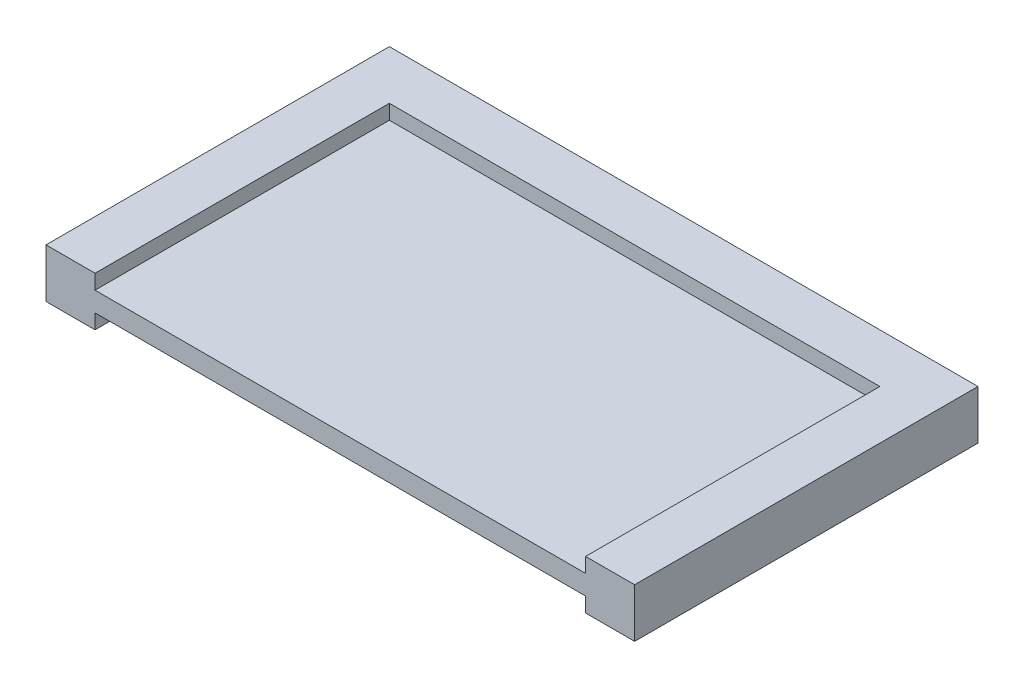
ISO-10303-21;
HEADER;
FILE_DESCRIPTION(('STEP AP214'),'2;1');
FILE_NAME('part.step','',(''),(''),'','','');
FILE_SCHEMA(('AUTOMOTIVE_DESIGN { 1 0 10303 214 1 1 1 1 }'));
ENDSEC;
DATA;
#1=APPLICATION_CONTEXT('core data for automotive mechanical design processes');
#2=APPLICATION_PROTOCOL_DEFINITION('international standard','automotive_design',2000,#1);
#3=PRODUCT_CONTEXT('',#1,'mechanical');
#4=PRODUCT('Part','Part','',(#3));
#5=PRODUCT_RELATED_PRODUCT_CATEGORY('part','',(#4));
#6=PRODUCT_DEFINITION_FORMATION('','',#4);
#7=PRODUCT_DEFINITION_CONTEXT('part definition',#1,'design');
#8=PRODUCT_DEFINITION('design','',#6,#7);
#9=PRODUCT_DEFINITION_SHAPE('','',#8);
#10=(LENGTH_UNIT() NAMED_UNIT(*) SI_UNIT(.MILLI.,.METRE.));
#11=(NAMED_UNIT(*) PLANE_ANGLE_UNIT() SI_UNIT($,.RADIAN.));
#12=(NAMED_UNIT(*) SI_UNIT($,.STERADIAN.) SOLID_ANGLE_UNIT());
#13=UNCERTAINTY_MEASURE_WITH_UNIT(LENGTH_MEASURE(1.E-05),#10,'distance_accuracy_value','');
#14=(GEOMETRIC_REPRESENTATION_CONTEXT(3) GLOBAL_UNCERTAINTY_ASSIGNED_CONTEXT((#13)) GLOBAL_UNIT_ASSIGNED_CONTEXT((#10,
#11,#12)) REPRESENTATION_CONTEXT('',''));
#15=CARTESIAN_POINT('',(0.,0.,0.));
#16=DIRECTION('',(0.,0.,1.));
#17=DIRECTION('',(1.,0.,0.));
#18=AXIS2_PLACEMENT_3D('',#15,#16,#17);
#19=CARTESIAN_POINT('',(-15.875,1.5875,0.));
#20=DIRECTION('',(-1.,0.,0.));
#21=DIRECTION('',(0.,0.,1.));
#22=AXIS2_PLACEMENT_3D('',#19,#20,#21);
#23=PLANE('',#22);
#24=DIRECTION('',(0.,0.,1.));
#25=VECTOR('',#24,1.);
#26=CARTESIAN_POINT('',(-15.875,-0.635,-19.05));
#27=LINE('',#26,#25);
#28=CARTESIAN_POINT('',(-15.875,-0.635,-19.05));
#29=VERTEX_POINT('',#28);
#30=CARTESIAN_POINT('',(-15.875,-0.635,0.));
#31=VERTEX_POINT('',#30);
#32=EDGE_CURVE('E188',#29,#31,#27,.T.);
#33=ORIENTED_EDGE('',*,*,#32,.T.);
#34=DIRECTION('',(0.,-1.,0.));
#35=VECTOR('',#34,1.);
#36=CARTESIAN_POINT('',(-15.875,1.5875,0.));
#37=LINE('',#36,#35);
#38=CARTESIAN_POINT('',(-15.875,-1.5875,0.));
#39=VERTEX_POINT('',#38);
#40=EDGE_CURVE('E174',#31,#39,#37,.T.);
#41=ORIENTED_EDGE('',*,*,#40,.T.);
#42=DIRECTION('',(0.,0.,-1.));
#43=VECTOR('',#42,1.);
#44=CARTESIAN_POINT('',(-15.875,-1.5875,0.));
#45=LINE('',#44,#43);
#46=CARTESIAN_POINT('',(-15.875,-1.5875,-19.05));
#47=VERTEX_POINT('',#46);
#48=EDGE_CURVE('E149',#39,#47,#45,.T.);
#49=ORIENTED_EDGE('',*,*,#48,.T.);
#50=DIRECTION('',(0.,-1.,0.));
#51=VECTOR('',#50,1.);
#52=CARTESIAN_POINT('',(-15.875,1.5875,-19.05));
#53=LINE('',#52,#51);
#54=EDGE_CURVE('E171',#29,#47,#53,.T.);
#55=ORIENTED_EDGE('',*,*,#54,.F.);
#56=EDGE_LOOP('',(#33,#41,#49,#55));
#57=FACE_BOUND('',#56,.T.);
#58=ADVANCED_FACE('F34',(#57),#23,.F.);
#59=CARTESIAN_POINT('',(-15.875,1.5875,-19.05));
#60=DIRECTION('',(0.,0.,-1.));
#61=DIRECTION('',(-1.,0.,0.));
#62=AXIS2_PLACEMENT_3D('',#59,#60,#61);
#63=PLANE('',#62);
#64=DIRECTION('',(-1.,0.,0.));
#65=VECTOR('',#64,1.);
#66=CARTESIAN_POINT('',(-15.875,-0.635,-19.05));
#67=LINE('',#66,#65);
#68=CARTESIAN_POINT('',(15.875,-0.635,-19.05));
#69=VERTEX_POINT('',#68);
#70=EDGE_CURVE('E199',#69,#29,#67,.T.);
#71=ORIENTED_EDGE('',*,*,#70,.T.);
#72=ORIENTED_EDGE('',*,*,#54,.T.);
#73=DIRECTION('',(1.,0.,0.));
#74=VECTOR('',#73,1.);
#75=CARTESIAN_POINT('',(-15.875,-1.5875,-19.05));
#76=LINE('',#75,#74);
#77=CARTESIAN_POINT('',(15.875,-1.5875,-19.05));
#78=VERTEX_POINT('',#77);
#79=EDGE_CURVE('E152',#47,#78,#76,.T.);
#80=ORIENTED_EDGE('',*,*,#79,.T.);
#81=DIRECTION('',(0.,-1.,0.));
#82=VECTOR('',#81,1.);
#83=CARTESIAN_POINT('',(15.875,1.5875,-19.05));
#84=LINE('',#83,#82);
#85=EDGE_CURVE('E167',#69,#78,#84,.T.);
#86=ORIENTED_EDGE('',*,*,#85,.F.);
#87=EDGE_LOOP('',(#71,#72,#80,#86));
#88=FACE_BOUND('',#87,.T.);
#89=ADVANCED_FACE('F197',(#88),#63,.F.);
#90=CARTESIAN_POINT('',(15.875,1.5875,0.));
#91=DIRECTION('',(1.,0.,0.));
#92=DIRECTION('',(0.,0.,-1.));
#93=AXIS2_PLACEMENT_3D('',#90,#91,#92);
#94=PLANE('',#93);
#95=DIRECTION('',(0.,0.,-1.));
#96=VECTOR('',#95,1.);
#97=CARTESIAN_POINT('',(15.875,-0.635,-19.05));
#98=LINE('',#97,#96);
#99=CARTESIAN_POINT('',(15.875,-0.635,0.));
#100=VERTEX_POINT('',#99);
#101=EDGE_CURVE('E49',#100,#69,#98,.T.);
#102=ORIENTED_EDGE('',*,*,#101,.T.);
#103=ORIENTED_EDGE('',*,*,#85,.T.);
#104=DIRECTION('',(0.,0.,1.));
#105=VECTOR('',#104,1.);
#106=CARTESIAN_POINT('',(15.875,-1.5875,0.));
#107=LINE('',#106,#105);
#108=CARTESIAN_POINT('',(15.875,-1.5875,0.));
#109=VERTEX_POINT('',#108);
#110=EDGE_CURVE('E155',#78,#109,#107,.T.);
#111=ORIENTED_EDGE('',*,*,#110,.T.);
#112=DIRECTION('',(0.,-1.,0.));
#113=VECTOR('',#112,1.);
#114=CARTESIAN_POINT('',(15.875,1.5875,0.));
#115=LINE('',#114,#113);
#116=EDGE_CURVE('E133',#100,#109,#115,.T.);
#117=ORIENTED_EDGE('',*,*,#116,.F.);
#118=EDGE_LOOP('',(#102,#103,#111,#117));
#119=FACE_BOUND('',#118,.T.);
#120=ADVANCED_FACE('F248',(#119),#94,.F.);
#121=CARTESIAN_POINT('',(-19.05,1.5875,-22.225));
#122=DIRECTION('',(1.,0.,0.));
#123=DIRECTION('',(0.,0.,-1.));
#124=AXIS2_PLACEMENT_3D('',#121,#122,#123);
#125=PLANE('',#124);
#126=DIRECTION('',(0.,0.,1.));
#127=VECTOR('',#126,1.);
#128=CARTESIAN_POINT('',(-19.05,-1.5875,-22.225));
#129=LINE('',#128,#127);
#130=CARTESIAN_POINT('',(-19.05,-1.5875,-22.225));
#131=VERTEX_POINT('',#130);
#132=CARTESIAN_POINT('',(-19.05,-1.5875,0.));
#133=VERTEX_POINT('',#132);
#134=EDGE_CURVE('E142',#131,#133,#129,.T.);
#135=ORIENTED_EDGE('',*,*,#134,.T.);
#136=DIRECTION('',(0.,-1.,0.));
#137=VECTOR('',#136,1.);
#138=CARTESIAN_POINT('',(-19.05,1.5875,0.));
#139=LINE('',#138,#137);
#140=CARTESIAN_POINT('',(-19.05,1.5875,0.));
#141=VERTEX_POINT('',#140);
#142=EDGE_CURVE('E11',#141,#133,#139,.T.);
#143=ORIENTED_EDGE('',*,*,#142,.F.);
#144=DIRECTION('',(0.,0.,1.));
#145=VECTOR('',#144,1.);
#146=CARTESIAN_POINT('',(-19.05,1.5875,-22.225));
#147=LINE('',#146,#145);
#148=CARTESIAN_POINT('',(-19.05,1.5875,-22.225));
#149=VERTEX_POINT('',#148);
#150=EDGE_CURVE('E162',#149,#141,#147,.T.);
#151=ORIENTED_EDGE('',*,*,#150,.F.);
#152=DIRECTION('',(0.,-1.,0.));
#153=VECTOR('',#152,1.);
#154=CARTESIAN_POINT('',(-19.05,1.5875,-22.225));
#155=LINE('',#154,#153);
#156=EDGE_CURVE('E138',#149,#131,#155,.T.);
#157=ORIENTED_EDGE('',*,*,#156,.T.);
#158=EDGE_LOOP('',(#135,#143,#151,#157));
#159=FACE_BOUND('',#158,.T.);
#160=ADVANCED_FACE('F36',(#159),#125,.F.);
#161=CARTESIAN_POINT('',(-15.875,1.5875,0.));
#162=VERTEX_POINT('',#161);
#163=CARTESIAN_POINT('',(-15.875,0.635,0.));
#164=VERTEX_POINT('',#163);
#165=EDGE_CURVE('E42',#162,#164,#37,.T.);
#166=ORIENTED_EDGE('',*,*,#165,.T.);
#167=DIRECTION('',(0.,0.,1.));
#168=VECTOR('',#167,1.);
#169=CARTESIAN_POINT('',(-15.875,0.635,-19.05));
#170=LINE('',#169,#168);
#171=CARTESIAN_POINT('',(-15.875,0.635,-19.05));
#172=VERTEX_POINT('',#171);
#173=EDGE_CURVE('E218',#172,#164,#170,.T.);
#174=ORIENTED_EDGE('',*,*,#173,.F.);
#175=CARTESIAN_POINT('',(-15.875,1.5875,-19.05));
#176=VERTEX_POINT('',#175);
#177=EDGE_CURVE('E172',#176,#172,#53,.T.);
#178=ORIENTED_EDGE('',*,*,#177,.F.);
#179=DIRECTION('',(0.,0.,-1.));
#180=VECTOR('',#179,1.);
#181=CARTESIAN_POINT('',(-15.875,1.5875,0.));
#182=LINE('',#181,#180);
#183=EDGE_CURVE('E234',#162,#176,#182,.T.);
#184=ORIENTED_EDGE('',*,*,#183,.F.);
#185=EDGE_LOOP('',(#166,#174,#178,#184));
#186=FACE_BOUND('',#185,.T.);
#187=ADVANCED_FACE('F241',(#186),#23,.F.);
#188=ORIENTED_EDGE('',*,*,#177,.T.);
#189=DIRECTION('',(-1.,0.,0.));
#190=VECTOR('',#189,1.);
#191=CARTESIAN_POINT('',(-15.875,0.635,-19.05));
#192=LINE('',#191,#190);
#193=CARTESIAN_POINT('',(15.875,0.635,-19.05));
#194=VERTEX_POINT('',#193);
#195=EDGE_CURVE('E146',#194,#172,#192,.T.);
#196=ORIENTED_EDGE('',*,*,#195,.F.);
#197=CARTESIAN_POINT('',(15.875,1.5875,-19.05));
#198=VERTEX_POINT('',#197);
#199=EDGE_CURVE('E168',#198,#194,#84,.T.);
#200=ORIENTED_EDGE('',*,*,#199,.F.);
#201=DIRECTION('',(1.,0.,0.));
#202=VECTOR('',#201,1.);
#203=CARTESIAN_POINT('',(-15.875,1.5875,-19.05));
#204=LINE('',#203,#202);
#205=EDGE_CURVE('E236',#176,#198,#204,.T.);
#206=ORIENTED_EDGE('',*,*,#205,.F.);
#207=EDGE_LOOP('',(#188,#196,#200,#206));
#208=FACE_BOUND('',#207,.T.);
#209=ADVANCED_FACE('F240',(#208),#63,.F.);
#210=ORIENTED_EDGE('',*,*,#199,.T.);
#211=DIRECTION('',(0.,0.,-1.));
#212=VECTOR('',#211,1.);
#213=CARTESIAN_POINT('',(15.875,0.635,-19.05));
#214=LINE('',#213,#212);
#215=CARTESIAN_POINT('',(15.875,0.635,0.));
#216=VERTEX_POINT('',#215);
#217=EDGE_CURVE('E216',#216,#194,#214,.T.);
#218=ORIENTED_EDGE('',*,*,#217,.F.);
#219=CARTESIAN_POINT('',(15.875,1.5875,0.));
#220=VERTEX_POINT('',#219);
#221=EDGE_CURVE('E165',#220,#216,#115,.T.);
#222=ORIENTED_EDGE('',*,*,#221,.F.);
#223=DIRECTION('',(0.,0.,1.));
#224=VECTOR('',#223,1.);
#225=CARTESIAN_POINT('',(15.875,1.5875,0.));
#226=LINE('',#225,#224);
#227=EDGE_CURVE('E122',#198,#220,#226,.T.);
#228=ORIENTED_EDGE('',*,*,#227,.F.);
#229=EDGE_LOOP('',(#210,#218,#222,#228));
#230=FACE_BOUND('',#229,.T.);
#231=ADVANCED_FACE('F221',(#230),#94,.F.);
#232=CARTESIAN_POINT('',(19.05,1.5875,0.));
#233=DIRECTION('',(0.,0.,-1.));
#234=DIRECTION('',(-1.,0.,0.));
#235=AXIS2_PLACEMENT_3D('',#232,#233,#234);
#236=PLANE('',#235);
#237=DIRECTION('',(1.,0.,0.));
#238=VECTOR('',#237,1.);
#239=CARTESIAN_POINT('',(19.05,-1.5875,0.));
#240=LINE('',#239,#238);
#241=CARTESIAN_POINT('',(19.05,-1.5875,0.));
#242=VERTEX_POINT('',#241);
#243=EDGE_CURVE('E130',#109,#242,#240,.T.);
#244=ORIENTED_EDGE('',*,*,#243,.T.);
#245=DIRECTION('',(0.,-1.,0.));
#246=VECTOR('',#245,1.);
#247=CARTESIAN_POINT('',(19.05,1.5875,0.));
#248=LINE('',#247,#246);
#249=CARTESIAN_POINT('',(19.05,1.5875,0.));
#250=VERTEX_POINT('',#249);
#251=EDGE_CURVE('E127',#250,#242,#248,.T.);
#252=ORIENTED_EDGE('',*,*,#251,.F.);
#253=DIRECTION('',(1.,0.,0.));
#254=VECTOR('',#253,1.);
#255=CARTESIAN_POINT('',(19.05,1.5875,0.));
#256=LINE('',#255,#254);
#257=EDGE_CURVE('E115',#220,#250,#256,.T.);
#258=ORIENTED_EDGE('',*,*,#257,.F.);
#259=ORIENTED_EDGE('',*,*,#221,.T.);
#260=DIRECTION('',(1.,0.,0.));
#261=VECTOR('',#260,1.);
#262=CARTESIAN_POINT('',(-15.875,0.635,0.));
#263=LINE('',#262,#261);
#264=EDGE_CURVE('E213',#164,#216,#263,.T.);
#265=ORIENTED_EDGE('',*,*,#264,.F.);
#266=ORIENTED_EDGE('',*,*,#165,.F.);
#267=DIRECTION('',(1.,0.,0.));
#268=VECTOR('',#267,1.);
#269=CARTESIAN_POINT('',(-19.05,1.5875,0.));
#270=LINE('',#269,#268);
#271=EDGE_CURVE('E99',#141,#162,#270,.T.);
#272=ORIENTED_EDGE('',*,*,#271,.F.);
#273=ORIENTED_EDGE('',*,*,#142,.T.);
#274=DIRECTION('',(1.,0.,0.));
#275=VECTOR('',#274,1.);
#276=CARTESIAN_POINT('',(-19.05,-1.5875,0.));
#277=LINE('',#276,#275);
#278=EDGE_CURVE('E145',#133,#39,#277,.T.);
#279=ORIENTED_EDGE('',*,*,#278,.T.);
#280=ORIENTED_EDGE('',*,*,#40,.F.);
#281=DIRECTION('',(1.,0.,0.));
#282=VECTOR('',#281,1.);
#283=CARTESIAN_POINT('',(-15.875,-0.635,0.));
#284=LINE('',#283,#282);
#285=EDGE_CURVE('E228',#31,#100,#284,.T.);
#286=ORIENTED_EDGE('',*,*,#285,.T.);
#287=ORIENTED_EDGE('',*,*,#116,.T.);
#288=EDGE_LOOP('',(#244,#252,#258,#259,#265,#266,#272,#273,#279,#280,#286,#287));
#289=FACE_BOUND('',#288,.T.);
#290=ADVANCED_FACE('F128',(#289),#236,.F.);
#291=CARTESIAN_POINT('',(19.05,1.5875,-22.225));
#292=DIRECTION('',(-1.,0.,0.));
#293=DIRECTION('',(0.,0.,1.));
#294=AXIS2_PLACEMENT_3D('',#291,#292,#293);
#295=PLANE('',#294);
#296=DIRECTION('',(0.,0.,-1.));
#297=VECTOR('',#296,1.);
#298=CARTESIAN_POINT('',(19.05,-1.5875,-22.225));
#299=LINE('',#298,#297);
#300=CARTESIAN_POINT('',(19.05,-1.5875,-22.225));
#301=VERTEX_POINT('',#300);
#302=EDGE_CURVE('E159',#242,#301,#299,.T.);
#303=ORIENTED_EDGE('',*,*,#302,.T.);
#304=DIRECTION('',(0.,-1.,0.));
#305=VECTOR('',#304,1.);
#306=CARTESIAN_POINT('',(19.05,1.5875,-22.225));
#307=LINE('',#306,#305);
#308=CARTESIAN_POINT('',(19.05,1.5875,-22.225));
#309=VERTEX_POINT('',#308);
#310=EDGE_CURVE('E134',#309,#301,#307,.T.);
#311=ORIENTED_EDGE('',*,*,#310,.F.);
#312=DIRECTION('',(0.,0.,-1.));
#313=VECTOR('',#312,1.);
#314=CARTESIAN_POINT('',(19.05,1.5875,-22.225));
#315=LINE('',#314,#313);
#316=EDGE_CURVE('E119',#250,#309,#315,.T.);
#317=ORIENTED_EDGE('',*,*,#316,.F.);
#318=ORIENTED_EDGE('',*,*,#251,.T.);
#319=EDGE_LOOP('',(#303,#311,#317,#318));
#320=FACE_BOUND('',#319,.T.);
#321=ADVANCED_FACE('F136',(#320),#295,.F.);
#322=CARTESIAN_POINT('',(19.05,1.5875,-22.225));
#323=DIRECTION('',(0.,0.,1.));
#324=DIRECTION('',(1.,0.,0.));
#325=AXIS2_PLACEMENT_3D('',#322,#323,#324);
#326=PLANE('',#325);
#327=DIRECTION('',(-1.,0.,0.));
#328=VECTOR('',#327,1.);
#329=CARTESIAN_POINT('',(19.05,-1.5875,-22.225));
#330=LINE('',#329,#328);
#331=EDGE_CURVE('E91',#301,#131,#330,.T.);
#332=ORIENTED_EDGE('',*,*,#331,.T.);
#333=ORIENTED_EDGE('',*,*,#156,.F.);
#334=DIRECTION('',(-1.,0.,0.));
#335=VECTOR('',#334,1.);
#336=CARTESIAN_POINT('',(19.05,1.5875,-22.225));
#337=LINE('',#336,#335);
#338=EDGE_CURVE('E58',#309,#149,#337,.T.);
#339=ORIENTED_EDGE('',*,*,#338,.F.);
#340=ORIENTED_EDGE('',*,*,#310,.T.);
#341=EDGE_LOOP('',(#332,#333,#339,#340));
#342=FACE_BOUND('',#341,.T.);
#343=ADVANCED_FACE('F265',(#342),#326,.F.);
#344=CARTESIAN_POINT('',(0.,1.5875,0.));
#345=DIRECTION('',(0.,1.,0.));
#346=DIRECTION('',(0.,0.,1.));
#347=AXIS2_PLACEMENT_3D('',#344,#345,#346);
#348=PLANE('',#347);
#349=ORIENTED_EDGE('',*,*,#150,.T.);
#350=ORIENTED_EDGE('',*,*,#271,.T.);
#351=ORIENTED_EDGE('',*,*,#183,.T.);
#352=ORIENTED_EDGE('',*,*,#205,.T.);
#353=ORIENTED_EDGE('',*,*,#227,.T.);
#354=ORIENTED_EDGE('',*,*,#257,.T.);
#355=ORIENTED_EDGE('',*,*,#316,.T.);
#356=ORIENTED_EDGE('',*,*,#338,.T.);
#357=EDGE_LOOP('',(#349,#350,#351,#352,#353,#354,#355,#356));
#358=FACE_BOUND('',#357,.T.);
#359=ADVANCED_FACE('F117',(#358),#348,.T.);
#360=CARTESIAN_POINT('',(0.,-1.5875,0.));
#361=DIRECTION('',(0.,1.,0.));
#362=DIRECTION('',(0.,0.,1.));
#363=AXIS2_PLACEMENT_3D('',#360,#361,#362);
#364=PLANE('',#363);
#365=ORIENTED_EDGE('',*,*,#134,.F.);
#366=ORIENTED_EDGE('',*,*,#331,.F.);
#367=ORIENTED_EDGE('',*,*,#302,.F.);
#368=ORIENTED_EDGE('',*,*,#243,.F.);
#369=ORIENTED_EDGE('',*,*,#110,.F.);
#370=ORIENTED_EDGE('',*,*,#79,.F.);
#371=ORIENTED_EDGE('',*,*,#48,.F.);
#372=ORIENTED_EDGE('',*,*,#278,.F.);
#373=EDGE_LOOP('',(#365,#366,#367,#368,#369,#370,#371,#372));
#374=FACE_BOUND('',#373,.T.);
#375=ADVANCED_FACE('F192',(#374),#364,.F.);
#376=CARTESIAN_POINT('',(0.,0.635,0.));
#377=DIRECTION('',(0.,1.,0.));
#378=DIRECTION('',(0.,0.,1.));
#379=AXIS2_PLACEMENT_3D('',#376,#377,#378);
#380=PLANE('',#379);
#381=ORIENTED_EDGE('',*,*,#173,.T.);
#382=ORIENTED_EDGE('',*,*,#264,.T.);
#383=ORIENTED_EDGE('',*,*,#217,.T.);
#384=ORIENTED_EDGE('',*,*,#195,.T.);
#385=EDGE_LOOP('',(#381,#382,#383,#384));
#386=FACE_BOUND('',#385,.T.);
#387=ADVANCED_FACE('F215',(#386),#380,.T.);
#388=CARTESIAN_POINT('',(0.,-0.635,0.));
#389=DIRECTION('',(0.,1.,0.));
#390=DIRECTION('',(0.,0.,1.));
#391=AXIS2_PLACEMENT_3D('',#388,#389,#390);
#392=PLANE('',#391);
#393=ORIENTED_EDGE('',*,*,#32,.F.);
#394=ORIENTED_EDGE('',*,*,#70,.F.);
#395=ORIENTED_EDGE('',*,*,#101,.F.);
#396=ORIENTED_EDGE('',*,*,#285,.F.);
#397=EDGE_LOOP('',(#393,#394,#395,#396));
#398=FACE_BOUND('',#397,.T.);
#399=ADVANCED_FACE('F272',(#398),#392,.F.);
#400=CLOSED_SHELL('',(#58,#89,#120,#160,#187,#209,#231,#290,#321,#343,#359,#375,#387,#399));
#401=MANIFOLD_SOLID_BREP('B2',#400);
#402=ADVANCED_BREP_SHAPE_REPRESENTATION('',(#18,#401),#14);
#403=SHAPE_DEFINITION_REPRESENTATION(#9,#402);
ENDSEC;
END-ISO-10303-21;
